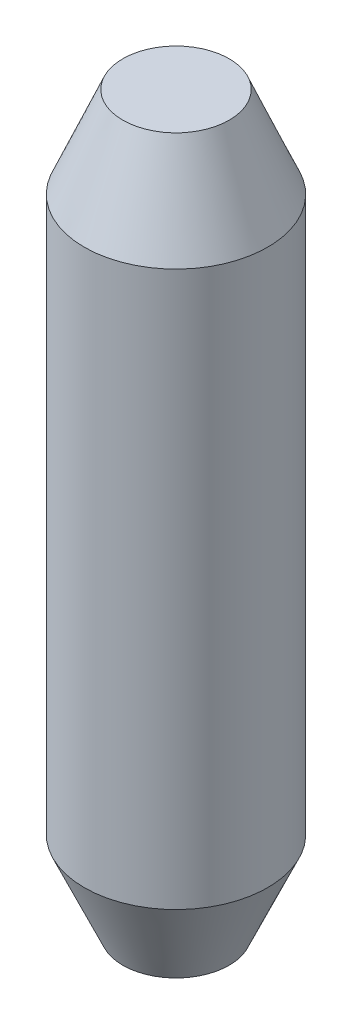
ISO-10303-21;
HEADER;
FILE_DESCRIPTION(('STEP AP214'),'2;1');
FILE_NAME('part.step','',(''),(''),'','','');
FILE_SCHEMA(('AUTOMOTIVE_DESIGN { 1 0 10303 214 1 1 1 1 }'));
ENDSEC;
DATA;
#1=APPLICATION_CONTEXT('core data for automotive mechanical design processes');
#2=APPLICATION_PROTOCOL_DEFINITION('international standard','automotive_design',2000,#1);
#3=PRODUCT_CONTEXT('',#1,'mechanical');
#4=PRODUCT('Part','Part','',(#3));
#5=PRODUCT_RELATED_PRODUCT_CATEGORY('part','',(#4));
#6=PRODUCT_DEFINITION_FORMATION('','',#4);
#7=PRODUCT_DEFINITION_CONTEXT('part definition',#1,'design');
#8=PRODUCT_DEFINITION('design','',#6,#7);
#9=PRODUCT_DEFINITION_SHAPE('','',#8);
#10=(LENGTH_UNIT() NAMED_UNIT(*) SI_UNIT(.MILLI.,.METRE.));
#11=(NAMED_UNIT(*) PLANE_ANGLE_UNIT() SI_UNIT($,.RADIAN.));
#12=(NAMED_UNIT(*) SI_UNIT($,.STERADIAN.) SOLID_ANGLE_UNIT());
#13=UNCERTAINTY_MEASURE_WITH_UNIT(LENGTH_MEASURE(1.E-05),#10,'distance_accuracy_value','');
#14=(GEOMETRIC_REPRESENTATION_CONTEXT(3) GLOBAL_UNCERTAINTY_ASSIGNED_CONTEXT((#13)) GLOBAL_UNIT_ASSIGNED_CONTEXT((#10,
#11,#12)) REPRESENTATION_CONTEXT('',''));
#15=CARTESIAN_POINT('',(0.,0.,0.));
#16=DIRECTION('',(0.,0.,1.));
#17=DIRECTION('',(1.,0.,0.));
#18=AXIS2_PLACEMENT_3D('',#15,#16,#17);
#19=CARTESIAN_POINT('',(0.,19.,0.));
#20=DIRECTION('',(0.,-1.,0.));
#21=DIRECTION('',(0.,0.,-1.));
#22=AXIS2_PLACEMENT_3D('',#19,#20,#21);
#23=CYLINDRICAL_SURFACE('',#22,2.38125);
#24=CARTESIAN_POINT('',(0.,16.6441476341763,0.));
#25=DIRECTION('',(0.,1.,0.));
#26=DIRECTION('',(0.,0.,1.));
#27=AXIS2_PLACEMENT_3D('',#24,#25,#26);
#28=CIRCLE('',#27,2.38125);
#29=CARTESIAN_POINT('',(0.,16.6441476341763,2.38125));
#30=VERTEX_POINT('',#29);
#31=EDGE_CURVE('E10',#30,#30,#28,.F.);
#32=ORIENTED_EDGE('',*,*,#31,.T.);
#33=EDGE_LOOP('',(#32));
#34=FACE_BOUND('',#33,.T.);
#35=CARTESIAN_POINT('',(0.,2.24603677390422,0.));
#36=DIRECTION('',(0.,1.,0.));
#37=DIRECTION('',(0.,0.,1.));
#38=AXIS2_PLACEMENT_3D('',#35,#36,#37);
#39=CIRCLE('',#38,2.38125);
#40=CARTESIAN_POINT('',(0.,2.24603677390422,2.38125));
#41=VERTEX_POINT('',#40);
#42=EDGE_CURVE('E49',#41,#41,#39,.T.);
#43=ORIENTED_EDGE('',*,*,#42,.T.);
#44=EDGE_LOOP('',(#43));
#45=FACE_BOUND('',#44,.T.);
#46=ADVANCED_FACE('F34',(#34,#45),#23,.T.);
#47=CARTESIAN_POINT('',(0.,19.,0.));
#48=DIRECTION('',(0.,1.,0.));
#49=DIRECTION('',(0.,0.,1.));
#50=AXIS2_PLACEMENT_3D('',#47,#48,#49);
#51=PLANE('',#50);
#52=CARTESIAN_POINT('',(0.,19.,0.));
#53=DIRECTION('',(0.,1.,0.));
#54=DIRECTION('',(0.,0.,1.));
#55=AXIS2_PLACEMENT_3D('',#52,#53,#54);
#56=CIRCLE('',#55,1.38125);
#57=CARTESIAN_POINT('',(0.,19.,1.38125));
#58=VERTEX_POINT('',#57);
#59=EDGE_CURVE('E41',#58,#58,#56,.T.);
#60=ORIENTED_EDGE('',*,*,#59,.T.);
#61=EDGE_LOOP('',(#60));
#62=FACE_BOUND('',#61,.T.);
#63=ADVANCED_FACE('F65',(#62),#51,.T.);
#64=CARTESIAN_POINT('',(0.,0.,0.));
#65=DIRECTION('',(0.,1.,0.));
#66=DIRECTION('',(0.,0.,1.));
#67=AXIS2_PLACEMENT_3D('',#64,#65,#66);
#68=PLANE('',#67);
#69=CARTESIAN_POINT('',(0.,0.,0.));
#70=DIRECTION('',(0.,1.,0.));
#71=DIRECTION('',(0.,0.,1.));
#72=AXIS2_PLACEMENT_3D('',#69,#70,#71);
#73=CIRCLE('',#72,1.38125);
#74=CARTESIAN_POINT('',(0.,0.,1.38125));
#75=VERTEX_POINT('',#74);
#76=EDGE_CURVE('E45',#75,#75,#73,.F.);
#77=ORIENTED_EDGE('',*,*,#76,.T.);
#78=EDGE_LOOP('',(#77));
#79=FACE_BOUND('',#78,.T.);
#80=ADVANCED_FACE('F58',(#79),#68,.F.);
#81=CARTESIAN_POINT('',(0.,2.24603677390422,0.));
#82=DIRECTION('',(0.,1.,0.));
#83=DIRECTION('',(0.,0.,1.));
#84=AXIS2_PLACEMENT_3D('',#81,#82,#83);
#85=CONICAL_SURFACE('',#84,2.38125,0.41887902047864);
#86=ORIENTED_EDGE('',*,*,#76,.F.);
#87=EDGE_LOOP('',(#86));
#88=FACE_BOUND('',#87,.T.);
#89=ORIENTED_EDGE('',*,*,#42,.F.);
#90=EDGE_LOOP('',(#89));
#91=FACE_BOUND('',#90,.T.);
#92=ADVANCED_FACE('F56',(#88,#91),#85,.T.);
#93=CARTESIAN_POINT('',(0.,19.,0.));
#94=DIRECTION('',(0.,-1.,0.));
#95=DIRECTION('',(0.,0.,-1.));
#96=AXIS2_PLACEMENT_3D('',#93,#94,#95);
#97=CONICAL_SURFACE('',#96,1.38125,0.401425727958697);
#98=ORIENTED_EDGE('',*,*,#31,.F.);
#99=EDGE_LOOP('',(#98));
#100=FACE_BOUND('',#99,.T.);
#101=ORIENTED_EDGE('',*,*,#59,.F.);
#102=EDGE_LOOP('',(#101));
#103=FACE_BOUND('',#102,.T.);
#104=ADVANCED_FACE('F36',(#100,#103),#97,.T.);
#105=CLOSED_SHELL('',(#46,#63,#80,#92,#104));
#106=MANIFOLD_SOLID_BREP('B2',#105);
#107=ADVANCED_BREP_SHAPE_REPRESENTATION('',(#18,#106),#14);
#108=SHAPE_DEFINITION_REPRESENTATION(#9,#107);
ENDSEC;
END-ISO-10303-21;
